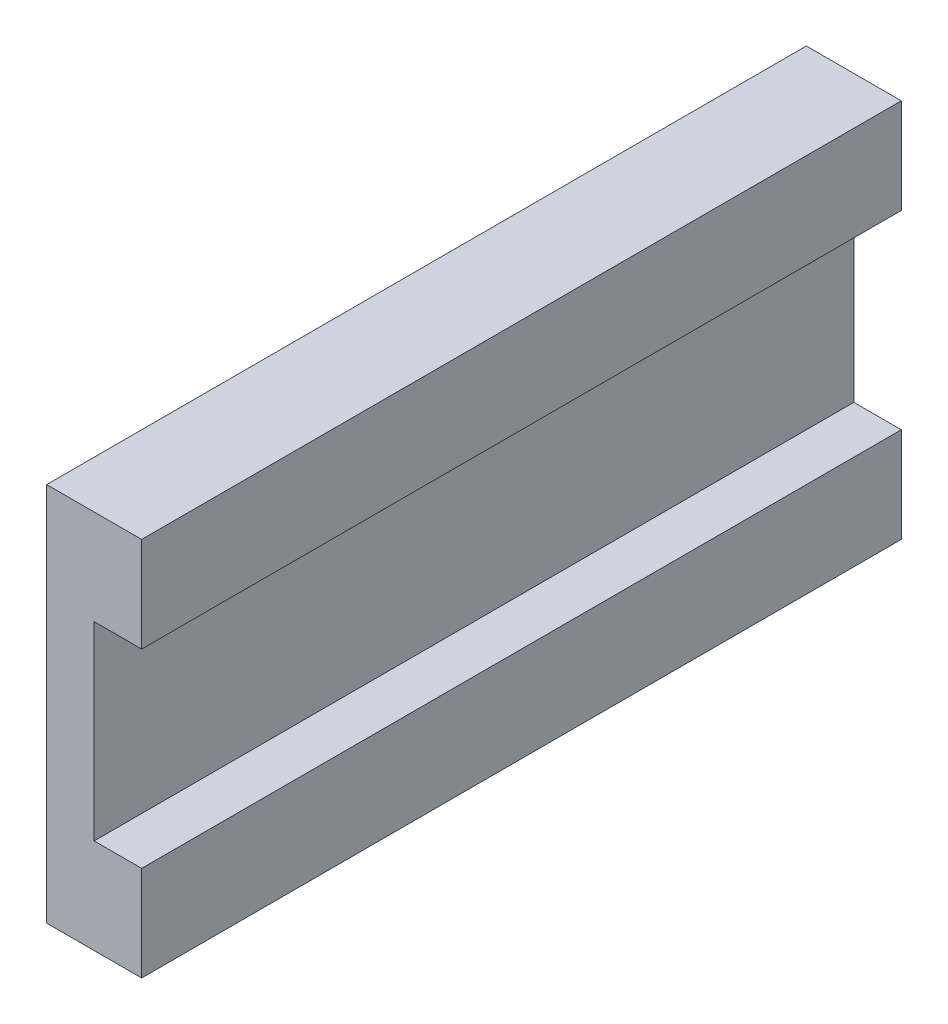
ISO-10303-21;
HEADER;
FILE_DESCRIPTION(('STEP AP214'),'2;1');
FILE_NAME('part.step','',(''),(''),'','','');
FILE_SCHEMA(('AUTOMOTIVE_DESIGN { 1 0 10303 214 1 1 1 1 }'));
ENDSEC;
DATA;
#1=APPLICATION_CONTEXT('core data for automotive mechanical design processes');
#2=APPLICATION_PROTOCOL_DEFINITION('international standard','automotive_design',2000,#1);
#3=PRODUCT_CONTEXT('',#1,'mechanical');
#4=PRODUCT('Part','Part','',(#3));
#5=PRODUCT_RELATED_PRODUCT_CATEGORY('part','',(#4));
#6=PRODUCT_DEFINITION_FORMATION('','',#4);
#7=PRODUCT_DEFINITION_CONTEXT('part definition',#1,'design');
#8=PRODUCT_DEFINITION('design','',#6,#7);
#9=PRODUCT_DEFINITION_SHAPE('','',#8);
#10=(LENGTH_UNIT() NAMED_UNIT(*) SI_UNIT(.MILLI.,.METRE.));
#11=(NAMED_UNIT(*) PLANE_ANGLE_UNIT() SI_UNIT($,.RADIAN.));
#12=(NAMED_UNIT(*) SI_UNIT($,.STERADIAN.) SOLID_ANGLE_UNIT());
#13=UNCERTAINTY_MEASURE_WITH_UNIT(LENGTH_MEASURE(1.E-05),#10,'distance_accuracy_value','');
#14=(GEOMETRIC_REPRESENTATION_CONTEXT(3) GLOBAL_UNCERTAINTY_ASSIGNED_CONTEXT((#13)) GLOBAL_UNIT_ASSIGNED_CONTEXT((#10,
#11,#12)) REPRESENTATION_CONTEXT('',''));
#15=CARTESIAN_POINT('',(0.,0.,0.));
#16=DIRECTION('',(0.,0.,1.));
#17=DIRECTION('',(1.,0.,0.));
#18=AXIS2_PLACEMENT_3D('',#15,#16,#17);
#19=CARTESIAN_POINT('',(19.9999999999997,0.,80.0000000000007));
#20=DIRECTION('',(0.,1.,0.));
#21=DIRECTION('',(-1.,0.,0.));
#22=AXIS2_PLACEMENT_3D('',#19,#20,#21);
#23=PLANE('',#22);
#24=DIRECTION('',(1.,0.,0.));
#25=VECTOR('',#24,1.);
#26=CARTESIAN_POINT('',(20.,0.,-80.));
#27=LINE('',#26,#25);
#28=CARTESIAN_POINT('',(0.,0.,-80.));
#29=VERTEX_POINT('',#28);
#30=CARTESIAN_POINT('',(20.,0.,-80.));
#31=VERTEX_POINT('',#30);
#32=EDGE_CURVE('E151',#29,#31,#27,.T.);
#33=ORIENTED_EDGE('',*,*,#32,.T.);
#34=DIRECTION('',(0.,0.,-1.));
#35=VECTOR('',#34,1.);
#36=CARTESIAN_POINT('',(19.9999999999997,0.,80.0000000000007));
#37=LINE('',#36,#35);
#38=CARTESIAN_POINT('',(19.9999999999997,0.,80.0000000000007));
#39=VERTEX_POINT('',#38);
#40=EDGE_CURVE('E11',#39,#31,#37,.T.);
#41=ORIENTED_EDGE('',*,*,#40,.F.);
#42=DIRECTION('',(1.,0.,0.));
#43=VECTOR('',#42,1.);
#44=CARTESIAN_POINT('',(19.9999999999997,0.,80.0000000000007));
#45=LINE('',#44,#43);
#46=CARTESIAN_POINT('',(-2.25514051876985E-13,-1.32070387576863E-13,80.0000000000007));
#47=VERTEX_POINT('',#46);
#48=EDGE_CURVE('E173',#47,#39,#45,.T.);
#49=ORIENTED_EDGE('',*,*,#48,.F.);
#50=DIRECTION('',(0.,0.,-1.));
#51=VECTOR('',#50,1.);
#52=CARTESIAN_POINT('',(-2.25514051876985E-13,-1.32070387576863E-13,80.0000000000007));
#53=LINE('',#52,#51);
#54=EDGE_CURVE('E147',#47,#29,#53,.T.);
#55=ORIENTED_EDGE('',*,*,#54,.T.);
#56=EDGE_LOOP('',(#33,#41,#49,#55));
#57=FACE_BOUND('',#56,.T.);
#58=ADVANCED_FACE('F49',(#57),#23,.F.);
#59=CARTESIAN_POINT('',(19.9999999999998,20.,80.0000000000007));
#60=DIRECTION('',(-1.,0.,0.));
#61=DIRECTION('',(0.,-1.,0.));
#62=AXIS2_PLACEMENT_3D('',#59,#60,#61);
#63=PLANE('',#62);
#64=DIRECTION('',(0.,1.,0.));
#65=VECTOR('',#64,1.);
#66=CARTESIAN_POINT('',(20.0000000000001,19.9999999999999,-80.));
#67=LINE('',#66,#65);
#68=CARTESIAN_POINT('',(20.0000000000001,19.9999999999999,-80.));
#69=VERTEX_POINT('',#68);
#70=EDGE_CURVE('E155',#31,#69,#67,.T.);
#71=ORIENTED_EDGE('',*,*,#70,.T.);
#72=DIRECTION('',(0.,0.,-1.));
#73=VECTOR('',#72,1.);
#74=CARTESIAN_POINT('',(19.9999999999998,20.,80.0000000000007));
#75=LINE('',#74,#73);
#76=CARTESIAN_POINT('',(19.9999999999998,20.,80.0000000000007));
#77=VERTEX_POINT('',#76);
#78=EDGE_CURVE('E58',#77,#69,#75,.T.);
#79=ORIENTED_EDGE('',*,*,#78,.F.);
#80=DIRECTION('',(0.,1.,0.));
#81=VECTOR('',#80,1.);
#82=CARTESIAN_POINT('',(19.9999999999998,20.,80.0000000000007));
#83=LINE('',#82,#81);
#84=EDGE_CURVE('E109',#39,#77,#83,.T.);
#85=ORIENTED_EDGE('',*,*,#84,.F.);
#86=ORIENTED_EDGE('',*,*,#40,.T.);
#87=EDGE_LOOP('',(#71,#79,#85,#86));
#88=FACE_BOUND('',#87,.T.);
#89=ADVANCED_FACE('F222',(#88),#63,.F.);
#90=CARTESIAN_POINT('',(9.99999999999983,19.9999999999999,80.0000000000007));
#91=DIRECTION('',(0.,-1.,0.));
#92=DIRECTION('',(0.,0.,-1.));
#93=AXIS2_PLACEMENT_3D('',#90,#91,#92);
#94=PLANE('',#93);
#95=DIRECTION('',(-1.,0.,0.));
#96=VECTOR('',#95,1.);
#97=CARTESIAN_POINT('',(9.99999999999997,19.9999999999999,-80.0000000000001));
#98=LINE('',#97,#96);
#99=CARTESIAN_POINT('',(9.99999999999997,19.9999999999999,-80.0000000000001));
#100=VERTEX_POINT('',#99);
#101=EDGE_CURVE('E158',#69,#100,#98,.T.);
#102=ORIENTED_EDGE('',*,*,#101,.T.);
#103=DIRECTION('',(0.,0.,-1.));
#104=VECTOR('',#103,1.);
#105=CARTESIAN_POINT('',(9.99999999999983,19.9999999999999,80.0000000000007));
#106=LINE('',#105,#104);
#107=CARTESIAN_POINT('',(9.99999999999983,19.9999999999999,80.0000000000007));
#108=VERTEX_POINT('',#107);
#109=EDGE_CURVE('E184',#108,#100,#106,.T.);
#110=ORIENTED_EDGE('',*,*,#109,.F.);
#111=DIRECTION('',(-1.,0.,0.));
#112=VECTOR('',#111,1.);
#113=CARTESIAN_POINT('',(9.99999999999983,19.9999999999999,80.0000000000007));
#114=LINE('',#113,#112);
#115=EDGE_CURVE('E195',#77,#108,#114,.T.);
#116=ORIENTED_EDGE('',*,*,#115,.F.);
#117=ORIENTED_EDGE('',*,*,#78,.T.);
#118=EDGE_LOOP('',(#102,#110,#116,#117));
#119=FACE_BOUND('',#118,.T.);
#120=ADVANCED_FACE('F193',(#119),#94,.F.);
#121=CARTESIAN_POINT('',(9.99999999999974,60.,80.0000000000007));
#122=DIRECTION('',(-1.,0.,0.));
#123=DIRECTION('',(0.,-1.,0.));
#124=AXIS2_PLACEMENT_3D('',#121,#122,#123);
#125=PLANE('',#124);
#126=DIRECTION('',(0.,1.,0.));
#127=VECTOR('',#126,1.);
#128=CARTESIAN_POINT('',(9.99999999999997,60.0000000000003,-80.0000000000001));
#129=LINE('',#128,#127);
#130=CARTESIAN_POINT('',(9.99999999999997,60.0000000000003,-80.0000000000001));
#131=VERTEX_POINT('',#130);
#132=EDGE_CURVE('E161',#100,#131,#129,.T.);
#133=ORIENTED_EDGE('',*,*,#132,.T.);
#134=DIRECTION('',(0.,0.,-1.));
#135=VECTOR('',#134,1.);
#136=CARTESIAN_POINT('',(9.99999999999974,60.,80.0000000000007));
#137=LINE('',#136,#135);
#138=CARTESIAN_POINT('',(9.99999999999974,60.,80.0000000000007));
#139=VERTEX_POINT('',#138);
#140=EDGE_CURVE('E180',#139,#131,#137,.T.);
#141=ORIENTED_EDGE('',*,*,#140,.F.);
#142=DIRECTION('',(0.,1.,0.));
#143=VECTOR('',#142,1.);
#144=CARTESIAN_POINT('',(9.99999999999974,60.,80.0000000000007));
#145=LINE('',#144,#143);
#146=EDGE_CURVE('E208',#108,#139,#145,.T.);
#147=ORIENTED_EDGE('',*,*,#146,.F.);
#148=ORIENTED_EDGE('',*,*,#109,.T.);
#149=EDGE_LOOP('',(#133,#141,#147,#148));
#150=FACE_BOUND('',#149,.T.);
#151=ADVANCED_FACE('F203',(#150),#125,.F.);
#152=CARTESIAN_POINT('',(19.9999999999999,60.,80.0000000000003));
#153=DIRECTION('',(0.,1.,0.));
#154=DIRECTION('',(0.,0.,1.));
#155=AXIS2_PLACEMENT_3D('',#152,#153,#154);
#156=PLANE('',#155);
#157=DIRECTION('',(1.,0.,0.));
#158=VECTOR('',#157,1.);
#159=CARTESIAN_POINT('',(20.0000000000001,60.,-80.));
#160=LINE('',#159,#158);
#161=CARTESIAN_POINT('',(20.0000000000001,60.,-80.));
#162=VERTEX_POINT('',#161);
#163=EDGE_CURVE('E164',#131,#162,#160,.T.);
#164=ORIENTED_EDGE('',*,*,#163,.T.);
#165=DIRECTION('',(0.,0.,-1.));
#166=VECTOR('',#165,1.);
#167=CARTESIAN_POINT('',(19.9999999999999,60.,80.0000000000003));
#168=LINE('',#167,#166);
#169=CARTESIAN_POINT('',(19.9999999999999,60.,80.0000000000003));
#170=VERTEX_POINT('',#169);
#171=EDGE_CURVE('E139',#170,#162,#168,.T.);
#172=ORIENTED_EDGE('',*,*,#171,.F.);
#173=DIRECTION('',(1.,0.,0.));
#174=VECTOR('',#173,1.);
#175=CARTESIAN_POINT('',(19.9999999999999,60.,80.0000000000003));
#176=LINE('',#175,#174);
#177=EDGE_CURVE('E128',#139,#170,#176,.T.);
#178=ORIENTED_EDGE('',*,*,#177,.F.);
#179=ORIENTED_EDGE('',*,*,#140,.T.);
#180=EDGE_LOOP('',(#164,#172,#178,#179));
#181=FACE_BOUND('',#180,.T.);
#182=ADVANCED_FACE('F206',(#181),#156,.F.);
#183=CARTESIAN_POINT('',(19.9999999999999,80.,80.0000000000003));
#184=DIRECTION('',(-1.,0.,0.));
#185=DIRECTION('',(0.,0.,1.));
#186=AXIS2_PLACEMENT_3D('',#183,#184,#185);
#187=PLANE('',#186);
#188=DIRECTION('',(0.,1.,0.));
#189=VECTOR('',#188,1.);
#190=CARTESIAN_POINT('',(20.,79.9999999999998,-80.));
#191=LINE('',#190,#189);
#192=CARTESIAN_POINT('',(20.,79.9999999999998,-80.));
#193=VERTEX_POINT('',#192);
#194=EDGE_CURVE('E137',#162,#193,#191,.T.);
#195=ORIENTED_EDGE('',*,*,#194,.T.);
#196=DIRECTION('',(0.,0.,-1.));
#197=VECTOR('',#196,1.);
#198=CARTESIAN_POINT('',(19.9999999999999,80.,80.0000000000003));
#199=LINE('',#198,#197);
#200=CARTESIAN_POINT('',(19.9999999999999,80.,80.0000000000003));
#201=VERTEX_POINT('',#200);
#202=EDGE_CURVE('E134',#201,#193,#199,.T.);
#203=ORIENTED_EDGE('',*,*,#202,.F.);
#204=DIRECTION('',(0.,1.,0.));
#205=VECTOR('',#204,1.);
#206=CARTESIAN_POINT('',(19.9999999999999,80.,80.0000000000003));
#207=LINE('',#206,#205);
#208=EDGE_CURVE('E122',#170,#201,#207,.T.);
#209=ORIENTED_EDGE('',*,*,#208,.F.);
#210=ORIENTED_EDGE('',*,*,#171,.T.);
#211=EDGE_LOOP('',(#195,#203,#209,#210));
#212=FACE_BOUND('',#211,.T.);
#213=ADVANCED_FACE('F135',(#212),#187,.F.);
#214=CARTESIAN_POINT('',(-3.59087759527199E-13,80.0000000000007,80.0000000000007));
#215=DIRECTION('',(0.,-1.,0.));
#216=DIRECTION('',(0.,0.,-1.));
#217=AXIS2_PLACEMENT_3D('',#214,#215,#216);
#218=PLANE('',#217);
#219=DIRECTION('',(-1.,0.,0.));
#220=VECTOR('',#219,1.);
#221=CARTESIAN_POINT('',(0.,80.,-80.));
#222=LINE('',#221,#220);
#223=CARTESIAN_POINT('',(0.,80.,-80.));
#224=VERTEX_POINT('',#223);
#225=EDGE_CURVE('E95',#193,#224,#222,.T.);
#226=ORIENTED_EDGE('',*,*,#225,.T.);
#227=DIRECTION('',(0.,0.,-1.));
#228=VECTOR('',#227,1.);
#229=CARTESIAN_POINT('',(-3.59087759527199E-13,80.0000000000007,80.0000000000007));
#230=LINE('',#229,#228);
#231=CARTESIAN_POINT('',(-3.59087759527199E-13,80.0000000000007,80.0000000000007));
#232=VERTEX_POINT('',#231);
#233=EDGE_CURVE('E140',#232,#224,#230,.T.);
#234=ORIENTED_EDGE('',*,*,#233,.F.);
#235=DIRECTION('',(-1.,0.,0.));
#236=VECTOR('',#235,1.);
#237=CARTESIAN_POINT('',(-3.59087759527199E-13,80.0000000000007,80.0000000000007));
#238=LINE('',#237,#236);
#239=EDGE_CURVE('E126',#201,#232,#238,.T.);
#240=ORIENTED_EDGE('',*,*,#239,.F.);
#241=ORIENTED_EDGE('',*,*,#202,.T.);
#242=EDGE_LOOP('',(#226,#234,#240,#241));
#243=FACE_BOUND('',#242,.T.);
#244=ADVANCED_FACE('F142',(#243),#218,.F.);
#245=CARTESIAN_POINT('',(-2.25514051876985E-13,-1.32070387576863E-13,80.0000000000007));
#246=DIRECTION('',(1.,0.,0.));
#247=DIRECTION('',(0.,0.,-1.));
#248=AXIS2_PLACEMENT_3D('',#245,#246,#247);
#249=PLANE('',#248);
#250=DIRECTION('',(0.,-1.,0.));
#251=VECTOR('',#250,1.);
#252=CARTESIAN_POINT('',(0.,0.,-80.));
#253=LINE('',#252,#251);
#254=EDGE_CURVE('E101',#224,#29,#253,.T.);
#255=ORIENTED_EDGE('',*,*,#254,.T.);
#256=ORIENTED_EDGE('',*,*,#54,.F.);
#257=DIRECTION('',(0.,-1.,0.));
#258=VECTOR('',#257,1.);
#259=CARTESIAN_POINT('',(-2.25514051876985E-13,-1.32070387576863E-13,80.0000000000007));
#260=LINE('',#259,#258);
#261=EDGE_CURVE('E66',#232,#47,#260,.T.);
#262=ORIENTED_EDGE('',*,*,#261,.F.);
#263=ORIENTED_EDGE('',*,*,#233,.T.);
#264=EDGE_LOOP('',(#255,#256,#262,#263));
#265=FACE_BOUND('',#264,.T.);
#266=ADVANCED_FACE('F241',(#265),#249,.F.);
#267=CARTESIAN_POINT('',(-2.25514051876985E-13,-1.32070387576863E-13,80.0000000000007));
#268=DIRECTION('',(0.,0.,-1.));
#269=DIRECTION('',(-1.,0.,0.));
#270=AXIS2_PLACEMENT_3D('',#267,#268,#269);
#271=PLANE('',#270);
#272=ORIENTED_EDGE('',*,*,#48,.T.);
#273=ORIENTED_EDGE('',*,*,#84,.T.);
#274=ORIENTED_EDGE('',*,*,#115,.T.);
#275=ORIENTED_EDGE('',*,*,#146,.T.);
#276=ORIENTED_EDGE('',*,*,#177,.T.);
#277=ORIENTED_EDGE('',*,*,#208,.T.);
#278=ORIENTED_EDGE('',*,*,#239,.T.);
#279=ORIENTED_EDGE('',*,*,#261,.T.);
#280=EDGE_LOOP('',(#272,#273,#274,#275,#276,#277,#278,#279));
#281=FACE_BOUND('',#280,.T.);
#282=ADVANCED_FACE('F124',(#281),#271,.F.);
#283=CARTESIAN_POINT('',(0.,0.,-80.));
#284=DIRECTION('',(0.,0.,-1.));
#285=DIRECTION('',(-1.,0.,0.));
#286=AXIS2_PLACEMENT_3D('',#283,#284,#285);
#287=PLANE('',#286);
#288=ORIENTED_EDGE('',*,*,#32,.F.);
#289=ORIENTED_EDGE('',*,*,#254,.F.);
#290=ORIENTED_EDGE('',*,*,#225,.F.);
#291=ORIENTED_EDGE('',*,*,#194,.F.);
#292=ORIENTED_EDGE('',*,*,#163,.F.);
#293=ORIENTED_EDGE('',*,*,#132,.F.);
#294=ORIENTED_EDGE('',*,*,#101,.F.);
#295=ORIENTED_EDGE('',*,*,#70,.F.);
#296=EDGE_LOOP('',(#288,#289,#290,#291,#292,#293,#294,#295));
#297=FACE_BOUND('',#296,.T.);
#298=ADVANCED_FACE('F199',(#297),#287,.T.);
#299=CLOSED_SHELL('',(#58,#89,#120,#151,#182,#213,#244,#266,#282,#298));
#300=MANIFOLD_SOLID_BREP('B2',#299);
#301=ADVANCED_BREP_SHAPE_REPRESENTATION('',(#18,#300),#14);
#302=SHAPE_DEFINITION_REPRESENTATION(#9,#301);
ENDSEC;
END-ISO-10303-21;
